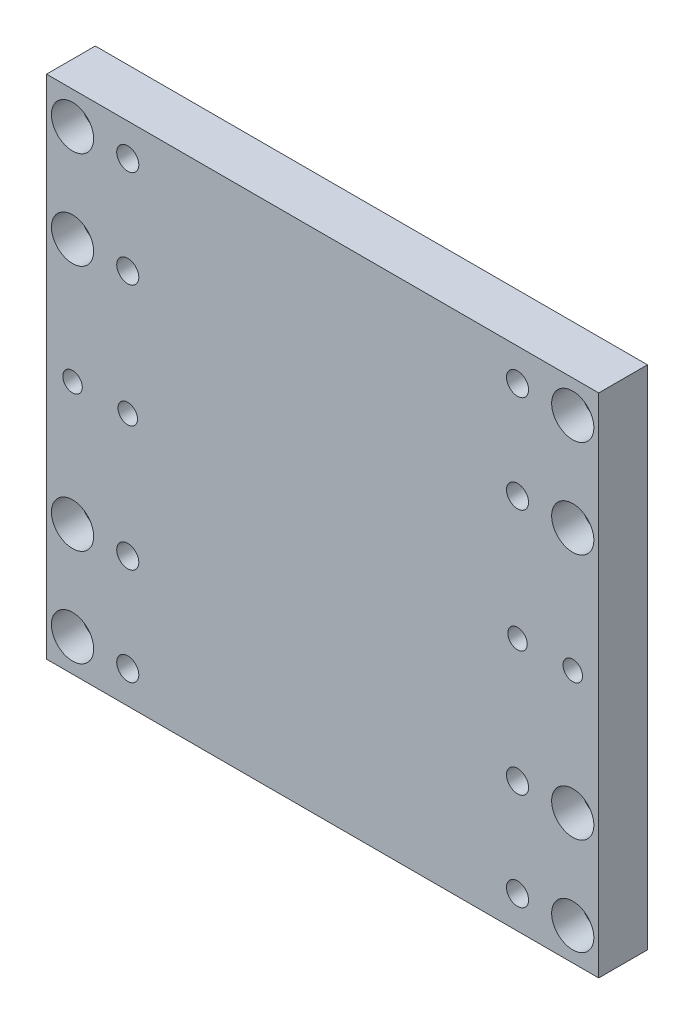
ISO-10303-21;
HEADER;
FILE_DESCRIPTION(('STEP AP214'),'2;1');
FILE_NAME('part.step','',(''),(''),'','','');
FILE_SCHEMA(('AUTOMOTIVE_DESIGN { 1 0 10303 214 1 1 1 1 }'));
ENDSEC;
DATA;
#1=APPLICATION_CONTEXT('core data for automotive mechanical design processes');
#2=APPLICATION_PROTOCOL_DEFINITION('international standard','automotive_design',2000,#1);
#3=PRODUCT_CONTEXT('',#1,'mechanical');
#4=PRODUCT('Part','Part','',(#3));
#5=PRODUCT_RELATED_PRODUCT_CATEGORY('part','',(#4));
#6=PRODUCT_DEFINITION_FORMATION('','',#4);
#7=PRODUCT_DEFINITION_CONTEXT('part definition',#1,'design');
#8=PRODUCT_DEFINITION('design','',#6,#7);
#9=PRODUCT_DEFINITION_SHAPE('','',#8);
#10=(LENGTH_UNIT() NAMED_UNIT(*) SI_UNIT(.MILLI.,.METRE.));
#11=(NAMED_UNIT(*) PLANE_ANGLE_UNIT() SI_UNIT($,.RADIAN.));
#12=(NAMED_UNIT(*) SI_UNIT($,.STERADIAN.) SOLID_ANGLE_UNIT());
#13=UNCERTAINTY_MEASURE_WITH_UNIT(LENGTH_MEASURE(1.E-05),#10,'distance_accuracy_value','');
#14=(GEOMETRIC_REPRESENTATION_CONTEXT(3) GLOBAL_UNCERTAINTY_ASSIGNED_CONTEXT((#13)) GLOBAL_UNIT_ASSIGNED_CONTEXT((#10,
#11,#12)) REPRESENTATION_CONTEXT('',''));
#15=CARTESIAN_POINT('',(0.,0.,0.));
#16=DIRECTION('',(0.,0.,1.));
#17=DIRECTION('',(1.,0.,0.));
#18=AXIS2_PLACEMENT_3D('',#15,#16,#17);
#19=CARTESIAN_POINT('',(-60.,0.,3.));
#20=DIRECTION('',(0.,0.,-1.));
#21=DIRECTION('',(-1.,0.,0.));
#22=AXIS2_PLACEMENT_3D('',#19,#20,#21);
#23=PLANE('',#22);
#24=CARTESIAN_POINT('',(-60.,0.,3.));
#25=DIRECTION('',(0.,0.,1.));
#26=DIRECTION('',(1.,0.,0.));
#27=AXIS2_PLACEMENT_3D('',#24,#25,#26);
#28=CIRCLE('',#27,3.);
#29=CARTESIAN_POINT('',(-57.,0.,3.));
#30=VERTEX_POINT('',#29);
#31=EDGE_CURVE('E20',#30,#30,#28,.T.);
#32=ORIENTED_EDGE('',*,*,#31,.T.);
#33=EDGE_LOOP('',(#32));
#34=FACE_BOUND('',#33,.T.);
#35=ADVANCED_FACE('F17',(#34),#23,.F.);
#36=CARTESIAN_POINT('',(60.,0.,3.));
#37=DIRECTION('',(0.,0.,-1.));
#38=DIRECTION('',(-1.,0.,0.));
#39=AXIS2_PLACEMENT_3D('',#36,#37,#38);
#40=PLANE('',#39);
#41=CARTESIAN_POINT('',(60.,0.,3.));
#42=DIRECTION('',(0.,0.,1.));
#43=DIRECTION('',(1.,0.,0.));
#44=AXIS2_PLACEMENT_3D('',#41,#42,#43);
#45=CIRCLE('',#44,3.);
#46=CARTESIAN_POINT('',(63.,0.,3.));
#47=VERTEX_POINT('',#46);
#48=EDGE_CURVE('E243',#47,#47,#45,.T.);
#49=ORIENTED_EDGE('',*,*,#48,.T.);
#50=EDGE_LOOP('',(#49));
#51=FACE_BOUND('',#50,.T.);
#52=ADVANCED_FACE('F254',(#51),#40,.F.);
#53=CARTESIAN_POINT('',(-60.,0.,15.));
#54=DIRECTION('',(0.,0.,1.));
#55=DIRECTION('',(1.,0.,0.));
#56=AXIS2_PLACEMENT_3D('',#53,#54,#55);
#57=CYLINDRICAL_SURFACE('',#56,3.);
#58=CARTESIAN_POINT('',(-60.,0.,15.));
#59=DIRECTION('',(0.,0.,1.));
#60=DIRECTION('',(1.,0.,0.));
#61=AXIS2_PLACEMENT_3D('',#58,#59,#60);
#62=CIRCLE('',#61,3.);
#63=CARTESIAN_POINT('',(-57.,0.,15.));
#64=VERTEX_POINT('',#63);
#65=EDGE_CURVE('E217',#64,#64,#62,.F.);
#66=ORIENTED_EDGE('',*,*,#65,.F.);
#67=EDGE_LOOP('',(#66));
#68=FACE_BOUND('',#67,.T.);
#69=ORIENTED_EDGE('',*,*,#31,.F.);
#70=EDGE_LOOP('',(#69));
#71=FACE_BOUND('',#70,.T.);
#72=ADVANCED_FACE('F251',(#68,#71),#57,.F.);
#73=CARTESIAN_POINT('',(60.,0.,15.));
#74=DIRECTION('',(0.,0.,1.));
#75=DIRECTION('',(1.,0.,0.));
#76=AXIS2_PLACEMENT_3D('',#73,#74,#75);
#77=CYLINDRICAL_SURFACE('',#76,3.);
#78=CARTESIAN_POINT('',(60.,0.,15.));
#79=DIRECTION('',(0.,0.,1.));
#80=DIRECTION('',(1.,0.,0.));
#81=AXIS2_PLACEMENT_3D('',#78,#79,#80);
#82=CIRCLE('',#81,3.);
#83=CARTESIAN_POINT('',(63.,0.,15.));
#84=VERTEX_POINT('',#83);
#85=EDGE_CURVE('E214',#84,#84,#82,.F.);
#86=ORIENTED_EDGE('',*,*,#85,.F.);
#87=EDGE_LOOP('',(#86));
#88=FACE_BOUND('',#87,.T.);
#89=ORIENTED_EDGE('',*,*,#48,.F.);
#90=EDGE_LOOP('',(#89));
#91=FACE_BOUND('',#90,.T.);
#92=ADVANCED_FACE('F253',(#88,#91),#77,.F.);
#93=CARTESIAN_POINT('',(76.9999999999995,68.,15.));
#94=DIRECTION('',(0.,0.,1.));
#95=DIRECTION('',(1.,0.,0.));
#96=AXIS2_PLACEMENT_3D('',#93,#94,#95);
#97=CYLINDRICAL_SURFACE('',#96,6.50000000000001);
#98=CARTESIAN_POINT('',(76.9999999999995,68.,15.));
#99=DIRECTION('',(0.,0.,1.));
#100=DIRECTION('',(1.,0.,0.));
#101=AXIS2_PLACEMENT_3D('',#98,#99,#100);
#102=CIRCLE('',#101,6.50000000000001);
#103=CARTESIAN_POINT('',(83.4999999999995,68.,15.));
#104=VERTEX_POINT('',#103);
#105=EDGE_CURVE('E211',#104,#104,#102,.F.);
#106=ORIENTED_EDGE('',*,*,#105,.F.);
#107=EDGE_LOOP('',(#106));
#108=FACE_BOUND('',#107,.T.);
#109=CARTESIAN_POINT('',(76.9999999999995,68.,6.));
#110=DIRECTION('',(0.,0.,1.));
#111=DIRECTION('',(1.,0.,0.));
#112=AXIS2_PLACEMENT_3D('',#109,#110,#111);
#113=CIRCLE('',#112,6.50000000000001);
#114=CARTESIAN_POINT('',(83.4999999999995,68.,6.));
#115=VERTEX_POINT('',#114);
#116=EDGE_CURVE('E241',#115,#115,#113,.F.);
#117=ORIENTED_EDGE('',*,*,#116,.T.);
#118=EDGE_LOOP('',(#117));
#119=FACE_BOUND('',#118,.T.);
#120=ADVANCED_FACE('F262',(#108,#119),#97,.F.);
#121=CARTESIAN_POINT('',(76.9999999999995,38.,15.));
#122=DIRECTION('',(0.,0.,1.));
#123=DIRECTION('',(1.,0.,0.));
#124=AXIS2_PLACEMENT_3D('',#121,#122,#123);
#125=CYLINDRICAL_SURFACE('',#124,6.50000000000001);
#126=CARTESIAN_POINT('',(76.9999999999995,38.,15.));
#127=DIRECTION('',(0.,0.,1.));
#128=DIRECTION('',(1.,0.,0.));
#129=AXIS2_PLACEMENT_3D('',#126,#127,#128);
#130=CIRCLE('',#129,6.50000000000001);
#131=CARTESIAN_POINT('',(83.4999999999995,38.,15.));
#132=VERTEX_POINT('',#131);
#133=EDGE_CURVE('E208',#132,#132,#130,.F.);
#134=ORIENTED_EDGE('',*,*,#133,.F.);
#135=EDGE_LOOP('',(#134));
#136=FACE_BOUND('',#135,.T.);
#137=CARTESIAN_POINT('',(76.9999999999995,38.,6.));
#138=DIRECTION('',(0.,0.,1.));
#139=DIRECTION('',(1.,0.,0.));
#140=AXIS2_PLACEMENT_3D('',#137,#138,#139);
#141=CIRCLE('',#140,6.50000000000001);
#142=CARTESIAN_POINT('',(83.4999999999995,38.,6.));
#143=VERTEX_POINT('',#142);
#144=EDGE_CURVE('E238',#143,#143,#141,.F.);
#145=ORIENTED_EDGE('',*,*,#144,.T.);
#146=EDGE_LOOP('',(#145));
#147=FACE_BOUND('',#146,.T.);
#148=ADVANCED_FACE('F415',(#136,#147),#125,.F.);
#149=CARTESIAN_POINT('',(76.9999999999995,-38.,15.));
#150=DIRECTION('',(0.,0.,1.));
#151=DIRECTION('',(1.,0.,0.));
#152=AXIS2_PLACEMENT_3D('',#149,#150,#151);
#153=CYLINDRICAL_SURFACE('',#152,6.50000000000001);
#154=CARTESIAN_POINT('',(76.9999999999995,-38.,15.));
#155=DIRECTION('',(0.,0.,1.));
#156=DIRECTION('',(1.,0.,0.));
#157=AXIS2_PLACEMENT_3D('',#154,#155,#156);
#158=CIRCLE('',#157,6.50000000000001);
#159=CARTESIAN_POINT('',(83.4999999999995,-38.,15.));
#160=VERTEX_POINT('',#159);
#161=EDGE_CURVE('E205',#160,#160,#158,.F.);
#162=ORIENTED_EDGE('',*,*,#161,.F.);
#163=EDGE_LOOP('',(#162));
#164=FACE_BOUND('',#163,.T.);
#165=CARTESIAN_POINT('',(76.9999999999995,-38.,6.));
#166=DIRECTION('',(0.,0.,1.));
#167=DIRECTION('',(1.,0.,0.));
#168=AXIS2_PLACEMENT_3D('',#165,#166,#167);
#169=CIRCLE('',#168,6.50000000000001);
#170=CARTESIAN_POINT('',(83.4999999999995,-38.,6.));
#171=VERTEX_POINT('',#170);
#172=EDGE_CURVE('E235',#171,#171,#169,.F.);
#173=ORIENTED_EDGE('',*,*,#172,.T.);
#174=EDGE_LOOP('',(#173));
#175=FACE_BOUND('',#174,.T.);
#176=ADVANCED_FACE('F411',(#164,#175),#153,.F.);
#177=CARTESIAN_POINT('',(76.9999999999995,-68.,15.));
#178=DIRECTION('',(0.,0.,1.));
#179=DIRECTION('',(1.,0.,0.));
#180=AXIS2_PLACEMENT_3D('',#177,#178,#179);
#181=CYLINDRICAL_SURFACE('',#180,6.50000000000001);
#182=CARTESIAN_POINT('',(76.9999999999995,-68.,15.));
#183=DIRECTION('',(0.,0.,1.));
#184=DIRECTION('',(1.,0.,0.));
#185=AXIS2_PLACEMENT_3D('',#182,#183,#184);
#186=CIRCLE('',#185,6.50000000000001);
#187=CARTESIAN_POINT('',(83.4999999999995,-68.,15.));
#188=VERTEX_POINT('',#187);
#189=EDGE_CURVE('E202',#188,#188,#186,.F.);
#190=ORIENTED_EDGE('',*,*,#189,.F.);
#191=EDGE_LOOP('',(#190));
#192=FACE_BOUND('',#191,.T.);
#193=CARTESIAN_POINT('',(76.9999999999995,-68.,6.));
#194=DIRECTION('',(0.,0.,1.));
#195=DIRECTION('',(1.,0.,0.));
#196=AXIS2_PLACEMENT_3D('',#193,#194,#195);
#197=CIRCLE('',#196,6.50000000000001);
#198=CARTESIAN_POINT('',(83.4999999999995,-68.,6.));
#199=VERTEX_POINT('',#198);
#200=EDGE_CURVE('E232',#199,#199,#197,.F.);
#201=ORIENTED_EDGE('',*,*,#200,.T.);
#202=EDGE_LOOP('',(#201));
#203=FACE_BOUND('',#202,.T.);
#204=ADVANCED_FACE('F407',(#192,#203),#181,.F.);
#205=CARTESIAN_POINT('',(-77.0000000000004,68.,15.));
#206=DIRECTION('',(0.,0.,1.));
#207=DIRECTION('',(1.,0.,0.));
#208=AXIS2_PLACEMENT_3D('',#205,#206,#207);
#209=CYLINDRICAL_SURFACE('',#208,6.50000000000001);
#210=CARTESIAN_POINT('',(-77.0000000000004,68.,15.));
#211=DIRECTION('',(0.,0.,1.));
#212=DIRECTION('',(1.,0.,0.));
#213=AXIS2_PLACEMENT_3D('',#210,#211,#212);
#214=CIRCLE('',#213,6.50000000000001);
#215=CARTESIAN_POINT('',(-70.5000000000004,68.,15.));
#216=VERTEX_POINT('',#215);
#217=EDGE_CURVE('E199',#216,#216,#214,.F.);
#218=ORIENTED_EDGE('',*,*,#217,.F.);
#219=EDGE_LOOP('',(#218));
#220=FACE_BOUND('',#219,.T.);
#221=CARTESIAN_POINT('',(-77.0000000000004,68.,6.));
#222=DIRECTION('',(0.,0.,1.));
#223=DIRECTION('',(1.,0.,0.));
#224=AXIS2_PLACEMENT_3D('',#221,#222,#223);
#225=CIRCLE('',#224,6.50000000000001);
#226=CARTESIAN_POINT('',(-70.5000000000004,68.,6.));
#227=VERTEX_POINT('',#226);
#228=EDGE_CURVE('E229',#227,#227,#225,.F.);
#229=ORIENTED_EDGE('',*,*,#228,.T.);
#230=EDGE_LOOP('',(#229));
#231=FACE_BOUND('',#230,.T.);
#232=ADVANCED_FACE('F403',(#220,#231),#209,.F.);
#233=CARTESIAN_POINT('',(-77.0000000000004,38.,15.));
#234=DIRECTION('',(0.,0.,1.));
#235=DIRECTION('',(1.,0.,0.));
#236=AXIS2_PLACEMENT_3D('',#233,#234,#235);
#237=CYLINDRICAL_SURFACE('',#236,6.50000000000001);
#238=CARTESIAN_POINT('',(-77.0000000000004,38.,15.));
#239=DIRECTION('',(0.,0.,1.));
#240=DIRECTION('',(1.,0.,0.));
#241=AXIS2_PLACEMENT_3D('',#238,#239,#240);
#242=CIRCLE('',#241,6.50000000000001);
#243=CARTESIAN_POINT('',(-70.5000000000004,38.,15.));
#244=VERTEX_POINT('',#243);
#245=EDGE_CURVE('E196',#244,#244,#242,.F.);
#246=ORIENTED_EDGE('',*,*,#245,.F.);
#247=EDGE_LOOP('',(#246));
#248=FACE_BOUND('',#247,.T.);
#249=CARTESIAN_POINT('',(-77.0000000000004,38.,6.));
#250=DIRECTION('',(0.,0.,1.));
#251=DIRECTION('',(1.,0.,0.));
#252=AXIS2_PLACEMENT_3D('',#249,#250,#251);
#253=CIRCLE('',#252,6.50000000000001);
#254=CARTESIAN_POINT('',(-70.5000000000004,38.,6.));
#255=VERTEX_POINT('',#254);
#256=EDGE_CURVE('E226',#255,#255,#253,.F.);
#257=ORIENTED_EDGE('',*,*,#256,.T.);
#258=EDGE_LOOP('',(#257));
#259=FACE_BOUND('',#258,.T.);
#260=ADVANCED_FACE('F399',(#248,#259),#237,.F.);
#261=CARTESIAN_POINT('',(-77.0000000000004,-38.,15.));
#262=DIRECTION('',(0.,0.,1.));
#263=DIRECTION('',(1.,0.,0.));
#264=AXIS2_PLACEMENT_3D('',#261,#262,#263);
#265=CYLINDRICAL_SURFACE('',#264,6.50000000000001);
#266=CARTESIAN_POINT('',(-77.0000000000004,-38.,15.));
#267=DIRECTION('',(0.,0.,1.));
#268=DIRECTION('',(1.,0.,0.));
#269=AXIS2_PLACEMENT_3D('',#266,#267,#268);
#270=CIRCLE('',#269,6.50000000000001);
#271=CARTESIAN_POINT('',(-70.5000000000004,-38.,15.));
#272=VERTEX_POINT('',#271);
#273=EDGE_CURVE('E193',#272,#272,#270,.F.);
#274=ORIENTED_EDGE('',*,*,#273,.F.);
#275=EDGE_LOOP('',(#274));
#276=FACE_BOUND('',#275,.T.);
#277=CARTESIAN_POINT('',(-77.0000000000004,-38.,6.));
#278=DIRECTION('',(0.,0.,1.));
#279=DIRECTION('',(1.,0.,0.));
#280=AXIS2_PLACEMENT_3D('',#277,#278,#279);
#281=CIRCLE('',#280,6.50000000000001);
#282=CARTESIAN_POINT('',(-70.5000000000004,-38.,6.));
#283=VERTEX_POINT('',#282);
#284=EDGE_CURVE('E223',#283,#283,#281,.F.);
#285=ORIENTED_EDGE('',*,*,#284,.T.);
#286=EDGE_LOOP('',(#285));
#287=FACE_BOUND('',#286,.T.);
#288=ADVANCED_FACE('F395',(#276,#287),#265,.F.);
#289=CARTESIAN_POINT('',(-77.0000000000004,-68.,15.));
#290=DIRECTION('',(0.,0.,1.));
#291=DIRECTION('',(1.,0.,0.));
#292=AXIS2_PLACEMENT_3D('',#289,#290,#291);
#293=CYLINDRICAL_SURFACE('',#292,6.50000000000001);
#294=CARTESIAN_POINT('',(-77.0000000000004,-68.,15.));
#295=DIRECTION('',(0.,0.,1.));
#296=DIRECTION('',(1.,0.,0.));
#297=AXIS2_PLACEMENT_3D('',#294,#295,#296);
#298=CIRCLE('',#297,6.50000000000001);
#299=CARTESIAN_POINT('',(-70.5000000000004,-68.,15.));
#300=VERTEX_POINT('',#299);
#301=EDGE_CURVE('E190',#300,#300,#298,.F.);
#302=ORIENTED_EDGE('',*,*,#301,.F.);
#303=EDGE_LOOP('',(#302));
#304=FACE_BOUND('',#303,.T.);
#305=CARTESIAN_POINT('',(-77.0000000000004,-68.,6.));
#306=DIRECTION('',(0.,0.,1.));
#307=DIRECTION('',(1.,0.,0.));
#308=AXIS2_PLACEMENT_3D('',#305,#306,#307);
#309=CIRCLE('',#308,6.50000000000001);
#310=CARTESIAN_POINT('',(-70.5000000000004,-68.,6.));
#311=VERTEX_POINT('',#310);
#312=EDGE_CURVE('E220',#311,#311,#309,.F.);
#313=ORIENTED_EDGE('',*,*,#312,.T.);
#314=EDGE_LOOP('',(#313));
#315=FACE_BOUND('',#314,.T.);
#316=ADVANCED_FACE('F391',(#304,#315),#293,.F.);
#317=CARTESIAN_POINT('',(81.4999999999995,68.,6.));
#318=DIRECTION('',(0.,0.,-1.));
#319=DIRECTION('',(-1.,0.,0.));
#320=AXIS2_PLACEMENT_3D('',#317,#318,#319);
#321=PLANE('',#320);
#322=ORIENTED_EDGE('',*,*,#116,.F.);
#323=EDGE_LOOP('',(#322));
#324=FACE_BOUND('',#323,.T.);
#325=CARTESIAN_POINT('',(76.9999999999995,68.,6.));
#326=DIRECTION('',(0.,0.,1.));
#327=DIRECTION('',(1.,0.,0.));
#328=AXIS2_PLACEMENT_3D('',#325,#326,#327);
#329=CIRCLE('',#328,4.5);
#330=CARTESIAN_POINT('',(81.4999999999995,68.,6.));
#331=VERTEX_POINT('',#330);
#332=EDGE_CURVE('E157',#331,#331,#329,.F.);
#333=ORIENTED_EDGE('',*,*,#332,.T.);
#334=EDGE_LOOP('',(#333));
#335=FACE_BOUND('',#334,.T.);
#336=ADVANCED_FACE('F387',(#324,#335),#321,.F.);
#337=CARTESIAN_POINT('',(81.4999999999995,38.,6.));
#338=DIRECTION('',(0.,0.,-1.));
#339=DIRECTION('',(-1.,0.,0.));
#340=AXIS2_PLACEMENT_3D('',#337,#338,#339);
#341=PLANE('',#340);
#342=ORIENTED_EDGE('',*,*,#144,.F.);
#343=EDGE_LOOP('',(#342));
#344=FACE_BOUND('',#343,.T.);
#345=CARTESIAN_POINT('',(76.9999999999995,38.,6.));
#346=DIRECTION('',(0.,0.,1.));
#347=DIRECTION('',(1.,0.,0.));
#348=AXIS2_PLACEMENT_3D('',#345,#346,#347);
#349=CIRCLE('',#348,4.5);
#350=CARTESIAN_POINT('',(81.4999999999995,38.,6.));
#351=VERTEX_POINT('',#350);
#352=EDGE_CURVE('E154',#351,#351,#349,.F.);
#353=ORIENTED_EDGE('',*,*,#352,.T.);
#354=EDGE_LOOP('',(#353));
#355=FACE_BOUND('',#354,.T.);
#356=ADVANCED_FACE('F383',(#344,#355),#341,.F.);
#357=CARTESIAN_POINT('',(81.4999999999995,-38.,6.));
#358=DIRECTION('',(0.,0.,-1.));
#359=DIRECTION('',(-1.,0.,0.));
#360=AXIS2_PLACEMENT_3D('',#357,#358,#359);
#361=PLANE('',#360);
#362=ORIENTED_EDGE('',*,*,#172,.F.);
#363=EDGE_LOOP('',(#362));
#364=FACE_BOUND('',#363,.T.);
#365=CARTESIAN_POINT('',(76.9999999999995,-38.,6.));
#366=DIRECTION('',(0.,0.,1.));
#367=DIRECTION('',(1.,0.,0.));
#368=AXIS2_PLACEMENT_3D('',#365,#366,#367);
#369=CIRCLE('',#368,4.5);
#370=CARTESIAN_POINT('',(81.4999999999995,-38.,6.));
#371=VERTEX_POINT('',#370);
#372=EDGE_CURVE('E151',#371,#371,#369,.F.);
#373=ORIENTED_EDGE('',*,*,#372,.T.);
#374=EDGE_LOOP('',(#373));
#375=FACE_BOUND('',#374,.T.);
#376=ADVANCED_FACE('F379',(#364,#375),#361,.F.);
#377=CARTESIAN_POINT('',(81.4999999999995,-68.,6.));
#378=DIRECTION('',(0.,0.,-1.));
#379=DIRECTION('',(-1.,0.,0.));
#380=AXIS2_PLACEMENT_3D('',#377,#378,#379);
#381=PLANE('',#380);
#382=ORIENTED_EDGE('',*,*,#200,.F.);
#383=EDGE_LOOP('',(#382));
#384=FACE_BOUND('',#383,.T.);
#385=CARTESIAN_POINT('',(76.9999999999995,-68.,6.));
#386=DIRECTION('',(0.,0.,1.));
#387=DIRECTION('',(1.,0.,0.));
#388=AXIS2_PLACEMENT_3D('',#385,#386,#387);
#389=CIRCLE('',#388,4.5);
#390=CARTESIAN_POINT('',(81.4999999999995,-68.,6.));
#391=VERTEX_POINT('',#390);
#392=EDGE_CURVE('E148',#391,#391,#389,.F.);
#393=ORIENTED_EDGE('',*,*,#392,.T.);
#394=EDGE_LOOP('',(#393));
#395=FACE_BOUND('',#394,.T.);
#396=ADVANCED_FACE('F375',(#384,#395),#381,.F.);
#397=CARTESIAN_POINT('',(-72.5000000000004,68.,6.));
#398=DIRECTION('',(0.,0.,-1.));
#399=DIRECTION('',(-1.,0.,0.));
#400=AXIS2_PLACEMENT_3D('',#397,#398,#399);
#401=PLANE('',#400);
#402=ORIENTED_EDGE('',*,*,#228,.F.);
#403=EDGE_LOOP('',(#402));
#404=FACE_BOUND('',#403,.T.);
#405=CARTESIAN_POINT('',(-77.0000000000004,68.,6.));
#406=DIRECTION('',(0.,0.,1.));
#407=DIRECTION('',(1.,0.,0.));
#408=AXIS2_PLACEMENT_3D('',#405,#406,#407);
#409=CIRCLE('',#408,4.5);
#410=CARTESIAN_POINT('',(-72.5000000000004,68.,6.));
#411=VERTEX_POINT('',#410);
#412=EDGE_CURVE('E145',#411,#411,#409,.F.);
#413=ORIENTED_EDGE('',*,*,#412,.T.);
#414=EDGE_LOOP('',(#413));
#415=FACE_BOUND('',#414,.T.);
#416=ADVANCED_FACE('F371',(#404,#415),#401,.F.);
#417=CARTESIAN_POINT('',(-72.5000000000004,38.,6.));
#418=DIRECTION('',(0.,0.,-1.));
#419=DIRECTION('',(-1.,0.,0.));
#420=AXIS2_PLACEMENT_3D('',#417,#418,#419);
#421=PLANE('',#420);
#422=ORIENTED_EDGE('',*,*,#256,.F.);
#423=EDGE_LOOP('',(#422));
#424=FACE_BOUND('',#423,.T.);
#425=CARTESIAN_POINT('',(-77.0000000000004,38.,6.));
#426=DIRECTION('',(0.,0.,1.));
#427=DIRECTION('',(1.,0.,0.));
#428=AXIS2_PLACEMENT_3D('',#425,#426,#427);
#429=CIRCLE('',#428,4.5);
#430=CARTESIAN_POINT('',(-72.5000000000004,38.,6.));
#431=VERTEX_POINT('',#430);
#432=EDGE_CURVE('E142',#431,#431,#429,.F.);
#433=ORIENTED_EDGE('',*,*,#432,.T.);
#434=EDGE_LOOP('',(#433));
#435=FACE_BOUND('',#434,.T.);
#436=ADVANCED_FACE('F367',(#424,#435),#421,.F.);
#437=CARTESIAN_POINT('',(-72.5000000000004,-38.,6.));
#438=DIRECTION('',(0.,0.,-1.));
#439=DIRECTION('',(-1.,0.,0.));
#440=AXIS2_PLACEMENT_3D('',#437,#438,#439);
#441=PLANE('',#440);
#442=ORIENTED_EDGE('',*,*,#284,.F.);
#443=EDGE_LOOP('',(#442));
#444=FACE_BOUND('',#443,.T.);
#445=CARTESIAN_POINT('',(-77.0000000000004,-38.,6.));
#446=DIRECTION('',(0.,0.,1.));
#447=DIRECTION('',(1.,0.,0.));
#448=AXIS2_PLACEMENT_3D('',#445,#446,#447);
#449=CIRCLE('',#448,4.5);
#450=CARTESIAN_POINT('',(-72.5000000000004,-38.,6.));
#451=VERTEX_POINT('',#450);
#452=EDGE_CURVE('E139',#451,#451,#449,.F.);
#453=ORIENTED_EDGE('',*,*,#452,.T.);
#454=EDGE_LOOP('',(#453));
#455=FACE_BOUND('',#454,.T.);
#456=ADVANCED_FACE('F363',(#444,#455),#441,.F.);
#457=CARTESIAN_POINT('',(-72.5000000000004,-68.,6.));
#458=DIRECTION('',(0.,0.,-1.));
#459=DIRECTION('',(-1.,0.,0.));
#460=AXIS2_PLACEMENT_3D('',#457,#458,#459);
#461=PLANE('',#460);
#462=ORIENTED_EDGE('',*,*,#312,.F.);
#463=EDGE_LOOP('',(#462));
#464=FACE_BOUND('',#463,.T.);
#465=CARTESIAN_POINT('',(-77.0000000000004,-68.,6.));
#466=DIRECTION('',(0.,0.,1.));
#467=DIRECTION('',(1.,0.,0.));
#468=AXIS2_PLACEMENT_3D('',#465,#466,#467);
#469=CIRCLE('',#468,4.5);
#470=CARTESIAN_POINT('',(-72.5000000000004,-68.,6.));
#471=VERTEX_POINT('',#470);
#472=EDGE_CURVE('E67',#471,#471,#469,.F.);
#473=ORIENTED_EDGE('',*,*,#472,.T.);
#474=EDGE_LOOP('',(#473));
#475=FACE_BOUND('',#474,.T.);
#476=ADVANCED_FACE('F360',(#464,#475),#461,.F.);
#477=CARTESIAN_POINT('',(0.,0.,15.));
#478=DIRECTION('',(0.,0.,1.));
#479=DIRECTION('',(1.,0.,0.));
#480=AXIS2_PLACEMENT_3D('',#477,#478,#479);
#481=PLANE('',#480);
#482=DIRECTION('',(0.,1.,0.));
#483=VECTOR('',#482,1.);
#484=CARTESIAN_POINT('',(85.,-78.,15.));
#485=LINE('',#484,#483);
#486=CARTESIAN_POINT('',(85.,-78.,15.));
#487=VERTEX_POINT('',#486);
#488=CARTESIAN_POINT('',(85.,78.,15.));
#489=VERTEX_POINT('',#488);
#490=EDGE_CURVE('E55',#487,#489,#485,.T.);
#491=ORIENTED_EDGE('',*,*,#490,.T.);
#492=DIRECTION('',(1.,0.,0.));
#493=VECTOR('',#492,1.);
#494=CARTESIAN_POINT('',(85.,78.,15.));
#495=LINE('',#494,#493);
#496=CARTESIAN_POINT('',(-85.,78.,15.));
#497=VERTEX_POINT('',#496);
#498=EDGE_CURVE('E815',#489,#497,#495,.F.);
#499=ORIENTED_EDGE('',*,*,#498,.T.);
#500=DIRECTION('',(0.,1.,0.));
#501=VECTOR('',#500,1.);
#502=CARTESIAN_POINT('',(-85.,-78.,15.));
#503=LINE('',#502,#501);
#504=CARTESIAN_POINT('',(-85.,-78.,15.));
#505=VERTEX_POINT('',#504);
#506=EDGE_CURVE('E61',#497,#505,#503,.F.);
#507=ORIENTED_EDGE('',*,*,#506,.T.);
#508=DIRECTION('',(-1.,0.,0.));
#509=VECTOR('',#508,1.);
#510=CARTESIAN_POINT('',(85.,-78.,15.));
#511=LINE('',#510,#509);
#512=EDGE_CURVE('E58',#505,#487,#511,.F.);
#513=ORIENTED_EDGE('',*,*,#512,.T.);
#514=EDGE_LOOP('',(#491,#499,#507,#513));
#515=FACE_BOUND('',#514,.T.);
#516=ORIENTED_EDGE('',*,*,#301,.T.);
#517=EDGE_LOOP('',(#516));
#518=FACE_BOUND('',#517,.T.);
#519=ORIENTED_EDGE('',*,*,#273,.T.);
#520=EDGE_LOOP('',(#519));
#521=FACE_BOUND('',#520,.T.);
#522=ORIENTED_EDGE('',*,*,#245,.T.);
#523=EDGE_LOOP('',(#522));
#524=FACE_BOUND('',#523,.T.);
#525=ORIENTED_EDGE('',*,*,#217,.T.);
#526=EDGE_LOOP('',(#525));
#527=FACE_BOUND('',#526,.T.);
#528=ORIENTED_EDGE('',*,*,#189,.T.);
#529=EDGE_LOOP('',(#528));
#530=FACE_BOUND('',#529,.T.);
#531=ORIENTED_EDGE('',*,*,#161,.T.);
#532=EDGE_LOOP('',(#531));
#533=FACE_BOUND('',#532,.T.);
#534=ORIENTED_EDGE('',*,*,#133,.T.);
#535=EDGE_LOOP('',(#534));
#536=FACE_BOUND('',#535,.T.);
#537=ORIENTED_EDGE('',*,*,#105,.T.);
#538=EDGE_LOOP('',(#537));
#539=FACE_BOUND('',#538,.T.);
#540=CARTESIAN_POINT('',(-77.0000000000004,0.,15.));
#541=DIRECTION('',(0.,0.,1.));
#542=DIRECTION('',(1.,0.,0.));
#543=AXIS2_PLACEMENT_3D('',#540,#541,#542);
#544=CIRCLE('',#543,3.);
#545=CARTESIAN_POINT('',(-74.0000000000004,0.,15.));
#546=VERTEX_POINT('',#545);
#547=EDGE_CURVE('E160',#546,#546,#544,.F.);
#548=ORIENTED_EDGE('',*,*,#547,.T.);
#549=EDGE_LOOP('',(#548));
#550=FACE_BOUND('',#549,.T.);
#551=CARTESIAN_POINT('',(76.9999999999995,0.,15.));
#552=DIRECTION('',(0.,0.,1.));
#553=DIRECTION('',(1.,0.,0.));
#554=AXIS2_PLACEMENT_3D('',#551,#552,#553);
#555=CIRCLE('',#554,3.);
#556=CARTESIAN_POINT('',(79.9999999999995,0.,15.));
#557=VERTEX_POINT('',#556);
#558=EDGE_CURVE('E163',#557,#557,#555,.F.);
#559=ORIENTED_EDGE('',*,*,#558,.T.);
#560=EDGE_LOOP('',(#559));
#561=FACE_BOUND('',#560,.T.);
#562=CARTESIAN_POINT('',(60.,68.,15.));
#563=DIRECTION('',(0.,0.,1.));
#564=DIRECTION('',(1.,0.,0.));
#565=AXIS2_PLACEMENT_3D('',#562,#563,#564);
#566=CIRCLE('',#565,3.4);
#567=CARTESIAN_POINT('',(63.4,68.,15.));
#568=VERTEX_POINT('',#567);
#569=EDGE_CURVE('E166',#568,#568,#566,.F.);
#570=ORIENTED_EDGE('',*,*,#569,.T.);
#571=EDGE_LOOP('',(#570));
#572=FACE_BOUND('',#571,.T.);
#573=CARTESIAN_POINT('',(60.,38.,15.));
#574=DIRECTION('',(0.,0.,1.));
#575=DIRECTION('',(1.,0.,0.));
#576=AXIS2_PLACEMENT_3D('',#573,#574,#575);
#577=CIRCLE('',#576,3.4);
#578=CARTESIAN_POINT('',(63.4,38.,15.));
#579=VERTEX_POINT('',#578);
#580=EDGE_CURVE('E169',#579,#579,#577,.F.);
#581=ORIENTED_EDGE('',*,*,#580,.T.);
#582=EDGE_LOOP('',(#581));
#583=FACE_BOUND('',#582,.T.);
#584=CARTESIAN_POINT('',(60.,-38.,15.));
#585=DIRECTION('',(0.,0.,1.));
#586=DIRECTION('',(1.,0.,0.));
#587=AXIS2_PLACEMENT_3D('',#584,#585,#586);
#588=CIRCLE('',#587,3.4);
#589=CARTESIAN_POINT('',(63.4,-38.,15.));
#590=VERTEX_POINT('',#589);
#591=EDGE_CURVE('E172',#590,#590,#588,.F.);
#592=ORIENTED_EDGE('',*,*,#591,.T.);
#593=EDGE_LOOP('',(#592));
#594=FACE_BOUND('',#593,.T.);
#595=CARTESIAN_POINT('',(60.,-68.,15.));
#596=DIRECTION('',(0.,0.,1.));
#597=DIRECTION('',(1.,0.,0.));
#598=AXIS2_PLACEMENT_3D('',#595,#596,#597);
#599=CIRCLE('',#598,3.4);
#600=CARTESIAN_POINT('',(63.4,-68.,15.));
#601=VERTEX_POINT('',#600);
#602=EDGE_CURVE('E175',#601,#601,#599,.F.);
#603=ORIENTED_EDGE('',*,*,#602,.T.);
#604=EDGE_LOOP('',(#603));
#605=FACE_BOUND('',#604,.T.);
#606=CARTESIAN_POINT('',(-60.,-68.,15.));
#607=DIRECTION('',(0.,0.,1.));
#608=DIRECTION('',(1.,0.,0.));
#609=AXIS2_PLACEMENT_3D('',#606,#607,#608);
#610=CIRCLE('',#609,3.4);
#611=CARTESIAN_POINT('',(-56.6,-68.,15.));
#612=VERTEX_POINT('',#611);
#613=EDGE_CURVE('E178',#612,#612,#610,.F.);
#614=ORIENTED_EDGE('',*,*,#613,.T.);
#615=EDGE_LOOP('',(#614));
#616=FACE_BOUND('',#615,.T.);
#617=CARTESIAN_POINT('',(-60.,-38.,15.));
#618=DIRECTION('',(0.,0.,1.));
#619=DIRECTION('',(1.,0.,0.));
#620=AXIS2_PLACEMENT_3D('',#617,#618,#619);
#621=CIRCLE('',#620,3.4);
#622=CARTESIAN_POINT('',(-56.6,-38.,15.));
#623=VERTEX_POINT('',#622);
#624=EDGE_CURVE('E181',#623,#623,#621,.F.);
#625=ORIENTED_EDGE('',*,*,#624,.T.);
#626=EDGE_LOOP('',(#625));
#627=FACE_BOUND('',#626,.T.);
#628=CARTESIAN_POINT('',(-60.,38.,15.));
#629=DIRECTION('',(0.,0.,1.));
#630=DIRECTION('',(1.,0.,0.));
#631=AXIS2_PLACEMENT_3D('',#628,#629,#630);
#632=CIRCLE('',#631,3.4);
#633=CARTESIAN_POINT('',(-56.6,38.,15.));
#634=VERTEX_POINT('',#633);
#635=EDGE_CURVE('E184',#634,#634,#632,.F.);
#636=ORIENTED_EDGE('',*,*,#635,.T.);
#637=EDGE_LOOP('',(#636));
#638=FACE_BOUND('',#637,.T.);
#639=CARTESIAN_POINT('',(-60.,68.,15.));
#640=DIRECTION('',(0.,0.,1.));
#641=DIRECTION('',(1.,0.,0.));
#642=AXIS2_PLACEMENT_3D('',#639,#640,#641);
#643=CIRCLE('',#642,3.4);
#644=CARTESIAN_POINT('',(-56.6,68.,15.));
#645=VERTEX_POINT('',#644);
#646=EDGE_CURVE('E187',#645,#645,#643,.F.);
#647=ORIENTED_EDGE('',*,*,#646,.T.);
#648=EDGE_LOOP('',(#647));
#649=FACE_BOUND('',#648,.T.);
#650=ORIENTED_EDGE('',*,*,#85,.T.);
#651=EDGE_LOOP('',(#650));
#652=FACE_BOUND('',#651,.T.);
#653=ORIENTED_EDGE('',*,*,#65,.T.);
#654=EDGE_LOOP('',(#653));
#655=FACE_BOUND('',#654,.T.);
#656=ADVANCED_FACE('F59',(#515,#518,#521,#524,#527,#530,#533,#536,#539,#550,#561,#572,#583,#594,
#605,#616,#627,#638,#649,#652,#655),#481,.T.);
#657=CARTESIAN_POINT('',(-60.,68.,15.));
#658=DIRECTION('',(0.,0.,1.));
#659=DIRECTION('',(1.,0.,0.));
#660=AXIS2_PLACEMENT_3D('',#657,#658,#659);
#661=CYLINDRICAL_SURFACE('',#660,3.4);
#662=CARTESIAN_POINT('',(-60.,68.,0.));
#663=DIRECTION('',(0.,0.,1.));
#664=DIRECTION('',(1.,0.,0.));
#665=AXIS2_PLACEMENT_3D('',#662,#663,#664);
#666=CIRCLE('',#665,3.4);
#667=CARTESIAN_POINT('',(-56.6,68.,0.));
#668=VERTEX_POINT('',#667);
#669=EDGE_CURVE('E133',#668,#668,#666,.F.);
#670=ORIENTED_EDGE('',*,*,#669,.T.);
#671=EDGE_LOOP('',(#670));
#672=FACE_BOUND('',#671,.T.);
#673=ORIENTED_EDGE('',*,*,#646,.F.);
#674=EDGE_LOOP('',(#673));
#675=FACE_BOUND('',#674,.T.);
#676=ADVANCED_FACE('F353',(#672,#675),#661,.F.);
#677=CARTESIAN_POINT('',(-60.,38.,15.));
#678=DIRECTION('',(0.,0.,1.));
#679=DIRECTION('',(1.,0.,0.));
#680=AXIS2_PLACEMENT_3D('',#677,#678,#679);
#681=CYLINDRICAL_SURFACE('',#680,3.4);
#682=CARTESIAN_POINT('',(-60.,38.,0.));
#683=DIRECTION('',(0.,0.,1.));
#684=DIRECTION('',(1.,0.,0.));
#685=AXIS2_PLACEMENT_3D('',#682,#683,#684);
#686=CIRCLE('',#685,3.4);
#687=CARTESIAN_POINT('',(-56.6,38.,0.));
#688=VERTEX_POINT('',#687);
#689=EDGE_CURVE('E130',#688,#688,#686,.F.);
#690=ORIENTED_EDGE('',*,*,#689,.T.);
#691=EDGE_LOOP('',(#690));
#692=FACE_BOUND('',#691,.T.);
#693=ORIENTED_EDGE('',*,*,#635,.F.);
#694=EDGE_LOOP('',(#693));
#695=FACE_BOUND('',#694,.T.);
#696=ADVANCED_FACE('F349',(#692,#695),#681,.F.);
#697=CARTESIAN_POINT('',(-60.,-38.,15.));
#698=DIRECTION('',(0.,0.,1.));
#699=DIRECTION('',(1.,0.,0.));
#700=AXIS2_PLACEMENT_3D('',#697,#698,#699);
#701=CYLINDRICAL_SURFACE('',#700,3.4);
#702=CARTESIAN_POINT('',(-60.,-38.,0.));
#703=DIRECTION('',(0.,0.,1.));
#704=DIRECTION('',(1.,0.,0.));
#705=AXIS2_PLACEMENT_3D('',#702,#703,#704);
#706=CIRCLE('',#705,3.4);
#707=CARTESIAN_POINT('',(-56.6,-38.,0.));
#708=VERTEX_POINT('',#707);
#709=EDGE_CURVE('E127',#708,#708,#706,.F.);
#710=ORIENTED_EDGE('',*,*,#709,.T.);
#711=EDGE_LOOP('',(#710));
#712=FACE_BOUND('',#711,.T.);
#713=ORIENTED_EDGE('',*,*,#624,.F.);
#714=EDGE_LOOP('',(#713));
#715=FACE_BOUND('',#714,.T.);
#716=ADVANCED_FACE('F345',(#712,#715),#701,.F.);
#717=CARTESIAN_POINT('',(-60.,-68.,15.));
#718=DIRECTION('',(0.,0.,1.));
#719=DIRECTION('',(1.,0.,0.));
#720=AXIS2_PLACEMENT_3D('',#717,#718,#719);
#721=CYLINDRICAL_SURFACE('',#720,3.4);
#722=CARTESIAN_POINT('',(-60.,-68.,0.));
#723=DIRECTION('',(0.,0.,1.));
#724=DIRECTION('',(1.,0.,0.));
#725=AXIS2_PLACEMENT_3D('',#722,#723,#724);
#726=CIRCLE('',#725,3.4);
#727=CARTESIAN_POINT('',(-56.6,-68.,0.));
#728=VERTEX_POINT('',#727);
#729=EDGE_CURVE('E124',#728,#728,#726,.F.);
#730=ORIENTED_EDGE('',*,*,#729,.T.);
#731=EDGE_LOOP('',(#730));
#732=FACE_BOUND('',#731,.T.);
#733=ORIENTED_EDGE('',*,*,#613,.F.);
#734=EDGE_LOOP('',(#733));
#735=FACE_BOUND('',#734,.T.);
#736=ADVANCED_FACE('F341',(#732,#735),#721,.F.);
#737=CARTESIAN_POINT('',(60.,-68.,15.));
#738=DIRECTION('',(0.,0.,1.));
#739=DIRECTION('',(1.,0.,0.));
#740=AXIS2_PLACEMENT_3D('',#737,#738,#739);
#741=CYLINDRICAL_SURFACE('',#740,3.4);
#742=CARTESIAN_POINT('',(60.,-68.,0.));
#743=DIRECTION('',(0.,0.,1.));
#744=DIRECTION('',(1.,0.,0.));
#745=AXIS2_PLACEMENT_3D('',#742,#743,#744);
#746=CIRCLE('',#745,3.4);
#747=CARTESIAN_POINT('',(63.4,-68.,0.));
#748=VERTEX_POINT('',#747);
#749=EDGE_CURVE('E121',#748,#748,#746,.F.);
#750=ORIENTED_EDGE('',*,*,#749,.T.);
#751=EDGE_LOOP('',(#750));
#752=FACE_BOUND('',#751,.T.);
#753=ORIENTED_EDGE('',*,*,#602,.F.);
#754=EDGE_LOOP('',(#753));
#755=FACE_BOUND('',#754,.T.);
#756=ADVANCED_FACE('F337',(#752,#755),#741,.F.);
#757=CARTESIAN_POINT('',(60.,-38.,15.));
#758=DIRECTION('',(0.,0.,1.));
#759=DIRECTION('',(1.,0.,0.));
#760=AXIS2_PLACEMENT_3D('',#757,#758,#759);
#761=CYLINDRICAL_SURFACE('',#760,3.4);
#762=CARTESIAN_POINT('',(60.,-38.,0.));
#763=DIRECTION('',(0.,0.,1.));
#764=DIRECTION('',(1.,0.,0.));
#765=AXIS2_PLACEMENT_3D('',#762,#763,#764);
#766=CIRCLE('',#765,3.4);
#767=CARTESIAN_POINT('',(63.4,-38.,0.));
#768=VERTEX_POINT('',#767);
#769=EDGE_CURVE('E118',#768,#768,#766,.F.);
#770=ORIENTED_EDGE('',*,*,#769,.T.);
#771=EDGE_LOOP('',(#770));
#772=FACE_BOUND('',#771,.T.);
#773=ORIENTED_EDGE('',*,*,#591,.F.);
#774=EDGE_LOOP('',(#773));
#775=FACE_BOUND('',#774,.T.);
#776=ADVANCED_FACE('F333',(#772,#775),#761,.F.);
#777=CARTESIAN_POINT('',(60.,38.,15.));
#778=DIRECTION('',(0.,0.,1.));
#779=DIRECTION('',(1.,0.,0.));
#780=AXIS2_PLACEMENT_3D('',#777,#778,#779);
#781=CYLINDRICAL_SURFACE('',#780,3.4);
#782=CARTESIAN_POINT('',(60.,38.,0.));
#783=DIRECTION('',(0.,0.,1.));
#784=DIRECTION('',(1.,0.,0.));
#785=AXIS2_PLACEMENT_3D('',#782,#783,#784);
#786=CIRCLE('',#785,3.4);
#787=CARTESIAN_POINT('',(63.4,38.,0.));
#788=VERTEX_POINT('',#787);
#789=EDGE_CURVE('E115',#788,#788,#786,.F.);
#790=ORIENTED_EDGE('',*,*,#789,.T.);
#791=EDGE_LOOP('',(#790));
#792=FACE_BOUND('',#791,.T.);
#793=ORIENTED_EDGE('',*,*,#580,.F.);
#794=EDGE_LOOP('',(#793));
#795=FACE_BOUND('',#794,.T.);
#796=ADVANCED_FACE('F329',(#792,#795),#781,.F.);
#797=CARTESIAN_POINT('',(60.,68.,15.));
#798=DIRECTION('',(0.,0.,1.));
#799=DIRECTION('',(1.,0.,0.));
#800=AXIS2_PLACEMENT_3D('',#797,#798,#799);
#801=CYLINDRICAL_SURFACE('',#800,3.4);
#802=CARTESIAN_POINT('',(60.,68.,0.));
#803=DIRECTION('',(0.,0.,1.));
#804=DIRECTION('',(1.,0.,0.));
#805=AXIS2_PLACEMENT_3D('',#802,#803,#804);
#806=CIRCLE('',#805,3.4);
#807=CARTESIAN_POINT('',(63.4,68.,0.));
#808=VERTEX_POINT('',#807);
#809=EDGE_CURVE('E112',#808,#808,#806,.F.);
#810=ORIENTED_EDGE('',*,*,#809,.T.);
#811=EDGE_LOOP('',(#810));
#812=FACE_BOUND('',#811,.T.);
#813=ORIENTED_EDGE('',*,*,#569,.F.);
#814=EDGE_LOOP('',(#813));
#815=FACE_BOUND('',#814,.T.);
#816=ADVANCED_FACE('F325',(#812,#815),#801,.F.);
#817=CARTESIAN_POINT('',(76.9999999999995,0.,15.));
#818=DIRECTION('',(0.,0.,1.));
#819=DIRECTION('',(1.,0.,0.));
#820=AXIS2_PLACEMENT_3D('',#817,#818,#819);
#821=CYLINDRICAL_SURFACE('',#820,3.);
#822=CARTESIAN_POINT('',(76.9999999999995,0.,0.));
#823=DIRECTION('',(0.,0.,1.));
#824=DIRECTION('',(1.,0.,0.));
#825=AXIS2_PLACEMENT_3D('',#822,#823,#824);
#826=CIRCLE('',#825,3.);
#827=CARTESIAN_POINT('',(79.9999999999995,0.,0.));
#828=VERTEX_POINT('',#827);
#829=EDGE_CURVE('E109',#828,#828,#826,.F.);
#830=ORIENTED_EDGE('',*,*,#829,.T.);
#831=EDGE_LOOP('',(#830));
#832=FACE_BOUND('',#831,.T.);
#833=ORIENTED_EDGE('',*,*,#558,.F.);
#834=EDGE_LOOP('',(#833));
#835=FACE_BOUND('',#834,.T.);
#836=ADVANCED_FACE('F321',(#832,#835),#821,.F.);
#837=CARTESIAN_POINT('',(-77.0000000000004,0.,15.));
#838=DIRECTION('',(0.,0.,1.));
#839=DIRECTION('',(1.,0.,0.));
#840=AXIS2_PLACEMENT_3D('',#837,#838,#839);
#841=CYLINDRICAL_SURFACE('',#840,3.);
#842=CARTESIAN_POINT('',(-77.0000000000004,0.,0.));
#843=DIRECTION('',(0.,0.,1.));
#844=DIRECTION('',(1.,0.,0.));
#845=AXIS2_PLACEMENT_3D('',#842,#843,#844);
#846=CIRCLE('',#845,3.);
#847=CARTESIAN_POINT('',(-74.0000000000004,0.,0.));
#848=VERTEX_POINT('',#847);
#849=EDGE_CURVE('E106',#848,#848,#846,.F.);
#850=ORIENTED_EDGE('',*,*,#849,.T.);
#851=EDGE_LOOP('',(#850));
#852=FACE_BOUND('',#851,.T.);
#853=ORIENTED_EDGE('',*,*,#547,.F.);
#854=EDGE_LOOP('',(#853));
#855=FACE_BOUND('',#854,.T.);
#856=ADVANCED_FACE('F317',(#852,#855),#841,.F.);
#857=CARTESIAN_POINT('',(76.9999999999995,68.,15.));
#858=DIRECTION('',(0.,0.,1.));
#859=DIRECTION('',(1.,0.,0.));
#860=AXIS2_PLACEMENT_3D('',#857,#858,#859);
#861=CYLINDRICAL_SURFACE('',#860,4.5);
#862=CARTESIAN_POINT('',(76.9999999999995,68.,0.));
#863=DIRECTION('',(0.,0.,1.));
#864=DIRECTION('',(1.,0.,0.));
#865=AXIS2_PLACEMENT_3D('',#862,#863,#864);
#866=CIRCLE('',#865,4.5);
#867=CARTESIAN_POINT('',(81.4999999999995,68.,0.));
#868=VERTEX_POINT('',#867);
#869=EDGE_CURVE('E103',#868,#868,#866,.F.);
#870=ORIENTED_EDGE('',*,*,#869,.T.);
#871=EDGE_LOOP('',(#870));
#872=FACE_BOUND('',#871,.T.);
#873=ORIENTED_EDGE('',*,*,#332,.F.);
#874=EDGE_LOOP('',(#873));
#875=FACE_BOUND('',#874,.T.);
#876=ADVANCED_FACE('F313',(#872,#875),#861,.F.);
#877=CARTESIAN_POINT('',(76.9999999999995,38.,15.));
#878=DIRECTION('',(0.,0.,1.));
#879=DIRECTION('',(1.,0.,0.));
#880=AXIS2_PLACEMENT_3D('',#877,#878,#879);
#881=CYLINDRICAL_SURFACE('',#880,4.5);
#882=CARTESIAN_POINT('',(76.9999999999995,38.,0.));
#883=DIRECTION('',(0.,0.,1.));
#884=DIRECTION('',(1.,0.,0.));
#885=AXIS2_PLACEMENT_3D('',#882,#883,#884);
#886=CIRCLE('',#885,4.5);
#887=CARTESIAN_POINT('',(81.4999999999995,38.,0.));
#888=VERTEX_POINT('',#887);
#889=EDGE_CURVE('E100',#888,#888,#886,.F.);
#890=ORIENTED_EDGE('',*,*,#889,.T.);
#891=EDGE_LOOP('',(#890));
#892=FACE_BOUND('',#891,.T.);
#893=ORIENTED_EDGE('',*,*,#352,.F.);
#894=EDGE_LOOP('',(#893));
#895=FACE_BOUND('',#894,.T.);
#896=ADVANCED_FACE('F309',(#892,#895),#881,.F.);
#897=CARTESIAN_POINT('',(76.9999999999995,-38.,15.));
#898=DIRECTION('',(0.,0.,1.));
#899=DIRECTION('',(1.,0.,0.));
#900=AXIS2_PLACEMENT_3D('',#897,#898,#899);
#901=CYLINDRICAL_SURFACE('',#900,4.5);
#902=CARTESIAN_POINT('',(76.9999999999995,-38.,0.));
#903=DIRECTION('',(0.,0.,1.));
#904=DIRECTION('',(1.,0.,0.));
#905=AXIS2_PLACEMENT_3D('',#902,#903,#904);
#906=CIRCLE('',#905,4.5);
#907=CARTESIAN_POINT('',(81.4999999999995,-38.,0.));
#908=VERTEX_POINT('',#907);
#909=EDGE_CURVE('E97',#908,#908,#906,.F.);
#910=ORIENTED_EDGE('',*,*,#909,.T.);
#911=EDGE_LOOP('',(#910));
#912=FACE_BOUND('',#911,.T.);
#913=ORIENTED_EDGE('',*,*,#372,.F.);
#914=EDGE_LOOP('',(#913));
#915=FACE_BOUND('',#914,.T.);
#916=ADVANCED_FACE('F305',(#912,#915),#901,.F.);
#917=CARTESIAN_POINT('',(76.9999999999995,-68.,15.));
#918=DIRECTION('',(0.,0.,1.));
#919=DIRECTION('',(1.,0.,0.));
#920=AXIS2_PLACEMENT_3D('',#917,#918,#919);
#921=CYLINDRICAL_SURFACE('',#920,4.5);
#922=CARTESIAN_POINT('',(76.9999999999995,-68.,0.));
#923=DIRECTION('',(0.,0.,1.));
#924=DIRECTION('',(1.,0.,0.));
#925=AXIS2_PLACEMENT_3D('',#922,#923,#924);
#926=CIRCLE('',#925,4.5);
#927=CARTESIAN_POINT('',(81.4999999999995,-68.,0.));
#928=VERTEX_POINT('',#927);
#929=EDGE_CURVE('E94',#928,#928,#926,.F.);
#930=ORIENTED_EDGE('',*,*,#929,.T.);
#931=EDGE_LOOP('',(#930));
#932=FACE_BOUND('',#931,.T.);
#933=ORIENTED_EDGE('',*,*,#392,.F.);
#934=EDGE_LOOP('',(#933));
#935=FACE_BOUND('',#934,.T.);
#936=ADVANCED_FACE('F301',(#932,#935),#921,.F.);
#937=CARTESIAN_POINT('',(-77.0000000000004,68.,15.));
#938=DIRECTION('',(0.,0.,1.));
#939=DIRECTION('',(1.,0.,0.));
#940=AXIS2_PLACEMENT_3D('',#937,#938,#939);
#941=CYLINDRICAL_SURFACE('',#940,4.5);
#942=CARTESIAN_POINT('',(-77.0000000000004,68.,0.));
#943=DIRECTION('',(0.,0.,1.));
#944=DIRECTION('',(1.,0.,0.));
#945=AXIS2_PLACEMENT_3D('',#942,#943,#944);
#946=CIRCLE('',#945,4.5);
#947=CARTESIAN_POINT('',(-72.5000000000004,68.,0.));
#948=VERTEX_POINT('',#947);
#949=EDGE_CURVE('E91',#948,#948,#946,.F.);
#950=ORIENTED_EDGE('',*,*,#949,.T.);
#951=EDGE_LOOP('',(#950));
#952=FACE_BOUND('',#951,.T.);
#953=ORIENTED_EDGE('',*,*,#412,.F.);
#954=EDGE_LOOP('',(#953));
#955=FACE_BOUND('',#954,.T.);
#956=ADVANCED_FACE('F297',(#952,#955),#941,.F.);
#957=CARTESIAN_POINT('',(-77.0000000000004,38.,15.));
#958=DIRECTION('',(0.,0.,1.));
#959=DIRECTION('',(1.,0.,0.));
#960=AXIS2_PLACEMENT_3D('',#957,#958,#959);
#961=CYLINDRICAL_SURFACE('',#960,4.5);
#962=CARTESIAN_POINT('',(-77.0000000000004,38.,0.));
#963=DIRECTION('',(0.,0.,1.));
#964=DIRECTION('',(1.,0.,0.));
#965=AXIS2_PLACEMENT_3D('',#962,#963,#964);
#966=CIRCLE('',#965,4.5);
#967=CARTESIAN_POINT('',(-72.5000000000004,38.,0.));
#968=VERTEX_POINT('',#967);
#969=EDGE_CURVE('E88',#968,#968,#966,.F.);
#970=ORIENTED_EDGE('',*,*,#969,.T.);
#971=EDGE_LOOP('',(#970));
#972=FACE_BOUND('',#971,.T.);
#973=ORIENTED_EDGE('',*,*,#432,.F.);
#974=EDGE_LOOP('',(#973));
#975=FACE_BOUND('',#974,.T.);
#976=ADVANCED_FACE('F293',(#972,#975),#961,.F.);
#977=CARTESIAN_POINT('',(-77.0000000000004,-38.,15.));
#978=DIRECTION('',(0.,0.,1.));
#979=DIRECTION('',(1.,0.,0.));
#980=AXIS2_PLACEMENT_3D('',#977,#978,#979);
#981=CYLINDRICAL_SURFACE('',#980,4.5);
#982=CARTESIAN_POINT('',(-77.0000000000004,-38.,0.));
#983=DIRECTION('',(0.,0.,1.));
#984=DIRECTION('',(1.,0.,0.));
#985=AXIS2_PLACEMENT_3D('',#982,#983,#984);
#986=CIRCLE('',#985,4.5);
#987=CARTESIAN_POINT('',(-72.5000000000004,-38.,0.));
#988=VERTEX_POINT('',#987);
#989=EDGE_CURVE('E85',#988,#988,#986,.F.);
#990=ORIENTED_EDGE('',*,*,#989,.T.);
#991=EDGE_LOOP('',(#990));
#992=FACE_BOUND('',#991,.T.);
#993=ORIENTED_EDGE('',*,*,#452,.F.);
#994=EDGE_LOOP('',(#993));
#995=FACE_BOUND('',#994,.T.);
#996=ADVANCED_FACE('F289',(#992,#995),#981,.F.);
#997=CARTESIAN_POINT('',(-77.0000000000004,-68.,15.));
#998=DIRECTION('',(0.,0.,1.));
#999=DIRECTION('',(1.,0.,0.));
#1000=AXIS2_PLACEMENT_3D('',#997,#998,#999);
#1001=CYLINDRICAL_SURFACE('',#1000,4.5);
#1002=CARTESIAN_POINT('',(-77.0000000000004,-68.,0.));
#1003=DIRECTION('',(0.,0.,1.));
#1004=DIRECTION('',(1.,0.,0.));
#1005=AXIS2_PLACEMENT_3D('',#1002,#1003,#1004);
#1006=CIRCLE('',#1005,4.5);
#1007=CARTESIAN_POINT('',(-72.5000000000004,-68.,0.));
#1008=VERTEX_POINT('',#1007);
#1009=EDGE_CURVE('E82',#1008,#1008,#1006,.F.);
#1010=ORIENTED_EDGE('',*,*,#1009,.T.);
#1011=EDGE_LOOP('',(#1010));
#1012=FACE_BOUND('',#1011,.T.);
#1013=ORIENTED_EDGE('',*,*,#472,.F.);
#1014=EDGE_LOOP('',(#1013));
#1015=FACE_BOUND('',#1014,.T.);
#1016=ADVANCED_FACE('F286',(#1012,#1015),#1001,.F.);
#1017=CARTESIAN_POINT('',(85.,-78.,15.));
#1018=DIRECTION('',(0.,1.,0.));
#1019=DIRECTION('',(-1.,0.,0.));
#1020=AXIS2_PLACEMENT_3D('',#1017,#1018,#1019);
#1021=PLANE('',#1020);
#1022=DIRECTION('',(0.,0.,1.));
#1023=VECTOR('',#1022,1.);
#1024=CARTESIAN_POINT('',(85.,-78.,15.));
#1025=LINE('',#1024,#1023);
#1026=CARTESIAN_POINT('',(85.,-78.,0.));
#1027=VERTEX_POINT('',#1026);
#1028=EDGE_CURVE('E66',#1027,#487,#1025,.T.);
#1029=ORIENTED_EDGE('',*,*,#1028,.T.);
#1030=ORIENTED_EDGE('',*,*,#512,.F.);
#1031=DIRECTION('',(0.,0.,-1.));
#1032=VECTOR('',#1031,1.);
#1033=CARTESIAN_POINT('',(-85.,-78.,15.));
#1034=LINE('',#1033,#1032);
#1035=CARTESIAN_POINT('',(-85.,-78.,0.));
#1036=VERTEX_POINT('',#1035);
#1037=EDGE_CURVE('E136',#505,#1036,#1034,.T.);
#1038=ORIENTED_EDGE('',*,*,#1037,.T.);
#1039=DIRECTION('',(1.,0.,0.));
#1040=VECTOR('',#1039,1.);
#1041=CARTESIAN_POINT('',(0.,-78.,0.));
#1042=LINE('',#1041,#1040);
#1043=EDGE_CURVE('E78',#1036,#1027,#1042,.T.);
#1044=ORIENTED_EDGE('',*,*,#1043,.T.);
#1045=EDGE_LOOP('',(#1029,#1030,#1038,#1044));
#1046=FACE_BOUND('',#1045,.T.);
#1047=ADVANCED_FACE('F77',(#1046),#1021,.F.);
#1048=CARTESIAN_POINT('',(85.,-78.,15.));
#1049=DIRECTION('',(-1.,0.,0.));
#1050=DIRECTION('',(0.,0.,1.));
#1051=AXIS2_PLACEMENT_3D('',#1048,#1049,#1050);
#1052=PLANE('',#1051);
#1053=DIRECTION('',(0.,0.,1.));
#1054=VECTOR('',#1053,1.);
#1055=CARTESIAN_POINT('',(85.,78.,15.));
#1056=LINE('',#1055,#1054);
#1057=CARTESIAN_POINT('',(85.,78.,0.));
#1058=VERTEX_POINT('',#1057);
#1059=EDGE_CURVE('E74',#1058,#489,#1056,.T.);
#1060=ORIENTED_EDGE('',*,*,#1059,.T.);
#1061=ORIENTED_EDGE('',*,*,#490,.F.);
#1062=ORIENTED_EDGE('',*,*,#1028,.F.);
#1063=DIRECTION('',(0.,1.,0.));
#1064=VECTOR('',#1063,1.);
#1065=CARTESIAN_POINT('',(85.,0.,0.));
#1066=LINE('',#1065,#1064);
#1067=EDGE_CURVE('E822',#1027,#1058,#1066,.T.);
#1068=ORIENTED_EDGE('',*,*,#1067,.T.);
#1069=EDGE_LOOP('',(#1060,#1061,#1062,#1068));
#1070=FACE_BOUND('',#1069,.T.);
#1071=ADVANCED_FACE('F71',(#1070),#1052,.F.);
#1072=CARTESIAN_POINT('',(85.,78.,15.));
#1073=DIRECTION('',(0.,-1.,0.));
#1074=DIRECTION('',(1.,0.,0.));
#1075=AXIS2_PLACEMENT_3D('',#1072,#1073,#1074);
#1076=PLANE('',#1075);
#1077=DIRECTION('',(0.,0.,-1.));
#1078=VECTOR('',#1077,1.);
#1079=CARTESIAN_POINT('',(-85.,78.,15.));
#1080=LINE('',#1079,#1078);
#1081=CARTESIAN_POINT('',(-85.,78.,0.));
#1082=VERTEX_POINT('',#1081);
#1083=EDGE_CURVE('E34',#1082,#497,#1080,.F.);
#1084=ORIENTED_EDGE('',*,*,#1083,.T.);
#1085=ORIENTED_EDGE('',*,*,#498,.F.);
#1086=ORIENTED_EDGE('',*,*,#1059,.F.);
#1087=DIRECTION('',(1.,0.,0.));
#1088=VECTOR('',#1087,1.);
#1089=CARTESIAN_POINT('',(0.,78.,0.));
#1090=LINE('',#1089,#1088);
#1091=EDGE_CURVE('E26',#1058,#1082,#1090,.F.);
#1092=ORIENTED_EDGE('',*,*,#1091,.T.);
#1093=EDGE_LOOP('',(#1084,#1085,#1086,#1092));
#1094=FACE_BOUND('',#1093,.T.);
#1095=ADVANCED_FACE('F274',(#1094),#1076,.F.);
#1096=CARTESIAN_POINT('',(-85.,-78.,15.));
#1097=DIRECTION('',(1.,0.,0.));
#1098=DIRECTION('',(0.,0.,-1.));
#1099=AXIS2_PLACEMENT_3D('',#1096,#1097,#1098);
#1100=PLANE('',#1099);
#1101=ORIENTED_EDGE('',*,*,#1037,.F.);
#1102=ORIENTED_EDGE('',*,*,#506,.F.);
#1103=ORIENTED_EDGE('',*,*,#1083,.F.);
#1104=DIRECTION('',(0.,1.,0.));
#1105=VECTOR('',#1104,1.);
#1106=CARTESIAN_POINT('',(-85.,0.,0.));
#1107=LINE('',#1106,#1105);
#1108=EDGE_CURVE('E11',#1082,#1036,#1107,.F.);
#1109=ORIENTED_EDGE('',*,*,#1108,.T.);
#1110=EDGE_LOOP('',(#1101,#1102,#1103,#1109));
#1111=FACE_BOUND('',#1110,.T.);
#1112=ADVANCED_FACE('F268',(#1111),#1100,.F.);
#1113=CARTESIAN_POINT('',(0.,0.,0.));
#1114=DIRECTION('',(0.,0.,1.));
#1115=DIRECTION('',(1.,0.,0.));
#1116=AXIS2_PLACEMENT_3D('',#1113,#1114,#1115);
#1117=PLANE('',#1116);
#1118=ORIENTED_EDGE('',*,*,#1091,.F.);
#1119=ORIENTED_EDGE('',*,*,#1067,.F.);
#1120=ORIENTED_EDGE('',*,*,#1043,.F.);
#1121=ORIENTED_EDGE('',*,*,#1108,.F.);
#1122=EDGE_LOOP('',(#1118,#1119,#1120,#1121));
#1123=FACE_BOUND('',#1122,.T.);
#1124=ORIENTED_EDGE('',*,*,#1009,.F.);
#1125=EDGE_LOOP('',(#1124));
#1126=FACE_BOUND('',#1125,.T.);
#1127=ORIENTED_EDGE('',*,*,#989,.F.);
#1128=EDGE_LOOP('',(#1127));
#1129=FACE_BOUND('',#1128,.T.);
#1130=ORIENTED_EDGE('',*,*,#969,.F.);
#1131=EDGE_LOOP('',(#1130));
#1132=FACE_BOUND('',#1131,.T.);
#1133=ORIENTED_EDGE('',*,*,#949,.F.);
#1134=EDGE_LOOP('',(#1133));
#1135=FACE_BOUND('',#1134,.T.);
#1136=ORIENTED_EDGE('',*,*,#929,.F.);
#1137=EDGE_LOOP('',(#1136));
#1138=FACE_BOUND('',#1137,.T.);
#1139=ORIENTED_EDGE('',*,*,#909,.F.);
#1140=EDGE_LOOP('',(#1139));
#1141=FACE_BOUND('',#1140,.T.);
#1142=ORIENTED_EDGE('',*,*,#889,.F.);
#1143=EDGE_LOOP('',(#1142));
#1144=FACE_BOUND('',#1143,.T.);
#1145=ORIENTED_EDGE('',*,*,#869,.F.);
#1146=EDGE_LOOP('',(#1145));
#1147=FACE_BOUND('',#1146,.T.);
#1148=ORIENTED_EDGE('',*,*,#849,.F.);
#1149=EDGE_LOOP('',(#1148));
#1150=FACE_BOUND('',#1149,.T.);
#1151=ORIENTED_EDGE('',*,*,#829,.F.);
#1152=EDGE_LOOP('',(#1151));
#1153=FACE_BOUND('',#1152,.T.);
#1154=ORIENTED_EDGE('',*,*,#809,.F.);
#1155=EDGE_LOOP('',(#1154));
#1156=FACE_BOUND('',#1155,.T.);
#1157=ORIENTED_EDGE('',*,*,#789,.F.);
#1158=EDGE_LOOP('',(#1157));
#1159=FACE_BOUND('',#1158,.T.);
#1160=ORIENTED_EDGE('',*,*,#769,.F.);
#1161=EDGE_LOOP('',(#1160));
#1162=FACE_BOUND('',#1161,.T.);
#1163=ORIENTED_EDGE('',*,*,#749,.F.);
#1164=EDGE_LOOP('',(#1163));
#1165=FACE_BOUND('',#1164,.T.);
#1166=ORIENTED_EDGE('',*,*,#729,.F.);
#1167=EDGE_LOOP('',(#1166));
#1168=FACE_BOUND('',#1167,.T.);
#1169=ORIENTED_EDGE('',*,*,#709,.F.);
#1170=EDGE_LOOP('',(#1169));
#1171=FACE_BOUND('',#1170,.T.);
#1172=ORIENTED_EDGE('',*,*,#689,.F.);
#1173=EDGE_LOOP('',(#1172));
#1174=FACE_BOUND('',#1173,.T.);
#1175=ORIENTED_EDGE('',*,*,#669,.F.);
#1176=EDGE_LOOP('',(#1175));
#1177=FACE_BOUND('',#1176,.T.);
#1178=ADVANCED_FACE('F266',(#1123,#1126,#1129,#1132,#1135,#1138,#1141,#1144,#1147,#1150,#1153,
#1156,#1159,#1162,#1165,#1168,#1171,#1174,#1177),#1117,.F.);
#1179=CLOSED_SHELL('',(#35,#52,#72,#92,#120,#148,#176,#204,#232,#260,#288,#316,#336,#356,#376,
#396,#416,#436,#456,#476,#656,#676,#696,#716,#736,#756,#776,#796,#816,#836,#856,#876,#896,#916,
#936,#956,#976,#996,#1016,#1047,#1071,#1095,#1112,#1178));
#1180=MANIFOLD_SOLID_BREP('B1',#1179);
#1181=ADVANCED_BREP_SHAPE_REPRESENTATION('',(#18,#1180),#14);
#1182=SHAPE_DEFINITION_REPRESENTATION(#9,#1181);
ENDSEC;
END-ISO-10303-21;
